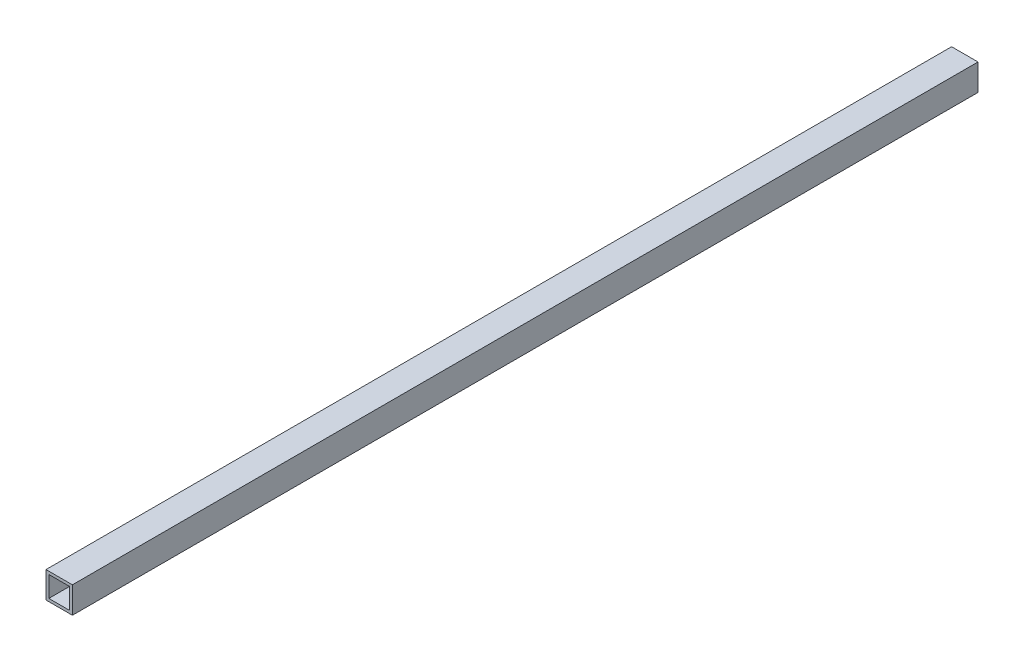
ISO-10303-21;
HEADER;
FILE_DESCRIPTION(('STEP AP214'),'2;1');
FILE_NAME('part.step','',(''),(''),'','','');
FILE_SCHEMA(('AUTOMOTIVE_DESIGN { 1 0 10303 214 1 1 1 1 }'));
ENDSEC;
DATA;
#1=APPLICATION_CONTEXT('core data for automotive mechanical design processes');
#2=APPLICATION_PROTOCOL_DEFINITION('international standard','automotive_design',2000,#1);
#3=PRODUCT_CONTEXT('',#1,'mechanical');
#4=PRODUCT('Part','Part','',(#3));
#5=PRODUCT_RELATED_PRODUCT_CATEGORY('part','',(#4));
#6=PRODUCT_DEFINITION_FORMATION('','',#4);
#7=PRODUCT_DEFINITION_CONTEXT('part definition',#1,'design');
#8=PRODUCT_DEFINITION('design','',#6,#7);
#9=PRODUCT_DEFINITION_SHAPE('','',#8);
#10=(LENGTH_UNIT() NAMED_UNIT(*) SI_UNIT(.MILLI.,.METRE.));
#11=(NAMED_UNIT(*) PLANE_ANGLE_UNIT() SI_UNIT($,.RADIAN.));
#12=(NAMED_UNIT(*) SI_UNIT($,.STERADIAN.) SOLID_ANGLE_UNIT());
#13=UNCERTAINTY_MEASURE_WITH_UNIT(LENGTH_MEASURE(1.E-05),#10,'distance_accuracy_value','');
#14=(GEOMETRIC_REPRESENTATION_CONTEXT(3) GLOBAL_UNCERTAINTY_ASSIGNED_CONTEXT((#13)) GLOBAL_UNIT_ASSIGNED_CONTEXT((#10,
#11,#12)) REPRESENTATION_CONTEXT('',''));
#15=CARTESIAN_POINT('',(0.,0.,0.));
#16=DIRECTION('',(0.,0.,1.));
#17=DIRECTION('',(1.,0.,0.));
#18=AXIS2_PLACEMENT_3D('',#15,#16,#17);
#19=CARTESIAN_POINT('',(0.,0.,480.));
#20=DIRECTION('',(0.,0.,1.));
#21=DIRECTION('',(1.,0.,0.));
#22=AXIS2_PLACEMENT_3D('',#19,#20,#21);
#23=PLANE('',#22);
#24=DIRECTION('',(0.,1.,0.));
#25=VECTOR('',#24,1.);
#26=CARTESIAN_POINT('',(7.,5.5,480.));
#27=LINE('',#26,#25);
#28=CARTESIAN_POINT('',(7.,-7.,480.));
#29=VERTEX_POINT('',#28);
#30=CARTESIAN_POINT('',(7.,7.,480.));
#31=VERTEX_POINT('',#30);
#32=EDGE_CURVE('E158',#29,#31,#27,.T.);
#33=ORIENTED_EDGE('',*,*,#32,.T.);
#34=DIRECTION('',(-1.,0.,0.));
#35=VECTOR('',#34,1.);
#36=CARTESIAN_POINT('',(-5.5,7.,480.));
#37=LINE('',#36,#35);
#38=CARTESIAN_POINT('',(-7.,7.,480.));
#39=VERTEX_POINT('',#38);
#40=EDGE_CURVE('E161',#31,#39,#37,.T.);
#41=ORIENTED_EDGE('',*,*,#40,.T.);
#42=DIRECTION('',(0.,-1.,0.));
#43=VECTOR('',#42,1.);
#44=CARTESIAN_POINT('',(-7.,5.5,480.));
#45=LINE('',#44,#43);
#46=CARTESIAN_POINT('',(-7.,-7.,480.));
#47=VERTEX_POINT('',#46);
#48=EDGE_CURVE('E164',#39,#47,#45,.T.);
#49=ORIENTED_EDGE('',*,*,#48,.T.);
#50=DIRECTION('',(1.,0.,0.));
#51=VECTOR('',#50,1.);
#52=CARTESIAN_POINT('',(-5.5,-7.,480.));
#53=LINE('',#52,#51);
#54=EDGE_CURVE('E166',#47,#29,#53,.T.);
#55=ORIENTED_EDGE('',*,*,#54,.T.);
#56=EDGE_LOOP('',(#33,#41,#49,#55));
#57=FACE_BOUND('',#56,.T.);
#58=DIRECTION('',(-1.,0.,0.));
#59=VECTOR('',#58,1.);
#60=CARTESIAN_POINT('',(-5.5,5.5,480.));
#61=LINE('',#60,#59);
#62=CARTESIAN_POINT('',(5.5,5.5,480.));
#63=VERTEX_POINT('',#62);
#64=CARTESIAN_POINT('',(-5.5,5.5,480.));
#65=VERTEX_POINT('',#64);
#66=EDGE_CURVE('E130',#63,#65,#61,.T.);
#67=ORIENTED_EDGE('',*,*,#66,.F.);
#68=DIRECTION('',(0.,1.,0.));
#69=VECTOR('',#68,1.);
#70=CARTESIAN_POINT('',(5.5,5.5,480.));
#71=LINE('',#70,#69);
#72=CARTESIAN_POINT('',(5.5,-5.5,480.));
#73=VERTEX_POINT('',#72);
#74=EDGE_CURVE('E122',#73,#63,#71,.T.);
#75=ORIENTED_EDGE('',*,*,#74,.F.);
#76=DIRECTION('',(1.,0.,0.));
#77=VECTOR('',#76,1.);
#78=CARTESIAN_POINT('',(-5.5,-5.5,480.));
#79=LINE('',#78,#77);
#80=CARTESIAN_POINT('',(-5.5,-5.5,480.));
#81=VERTEX_POINT('',#80);
#82=EDGE_CURVE('E144',#81,#73,#79,.T.);
#83=ORIENTED_EDGE('',*,*,#82,.F.);
#84=DIRECTION('',(0.,-1.,0.));
#85=VECTOR('',#84,1.);
#86=CARTESIAN_POINT('',(-5.5,5.5,480.));
#87=LINE('',#86,#85);
#88=EDGE_CURVE('E142',#65,#81,#87,.T.);
#89=ORIENTED_EDGE('',*,*,#88,.F.);
#90=EDGE_LOOP('',(#67,#75,#83,#89));
#91=FACE_BOUND('',#90,.T.);
#92=ADVANCED_FACE('F57',(#57,#91),#23,.T.);
#93=CARTESIAN_POINT('',(0.,0.,0.));
#94=DIRECTION('',(0.,0.,1.));
#95=DIRECTION('',(1.,0.,0.));
#96=AXIS2_PLACEMENT_3D('',#93,#94,#95);
#97=PLANE('',#96);
#98=DIRECTION('',(0.,1.,0.));
#99=VECTOR('',#98,1.);
#100=CARTESIAN_POINT('',(7.,5.5,0.));
#101=LINE('',#100,#99);
#102=CARTESIAN_POINT('',(7.,-7.,0.));
#103=VERTEX_POINT('',#102);
#104=CARTESIAN_POINT('',(7.,7.,0.));
#105=VERTEX_POINT('',#104);
#106=EDGE_CURVE('E138',#103,#105,#101,.T.);
#107=ORIENTED_EDGE('',*,*,#106,.F.);
#108=DIRECTION('',(1.,0.,0.));
#109=VECTOR('',#108,1.);
#110=CARTESIAN_POINT('',(-5.5,-7.,0.));
#111=LINE('',#110,#109);
#112=CARTESIAN_POINT('',(-7.,-7.,0.));
#113=VERTEX_POINT('',#112);
#114=EDGE_CURVE('E162',#113,#103,#111,.T.);
#115=ORIENTED_EDGE('',*,*,#114,.F.);
#116=DIRECTION('',(0.,-1.,0.));
#117=VECTOR('',#116,1.);
#118=CARTESIAN_POINT('',(-7.,5.5,0.));
#119=LINE('',#118,#117);
#120=CARTESIAN_POINT('',(-7.,7.,0.));
#121=VERTEX_POINT('',#120);
#122=EDGE_CURVE('E173',#121,#113,#119,.T.);
#123=ORIENTED_EDGE('',*,*,#122,.F.);
#124=DIRECTION('',(-1.,0.,0.));
#125=VECTOR('',#124,1.);
#126=CARTESIAN_POINT('',(-5.5,7.,0.));
#127=LINE('',#126,#125);
#128=EDGE_CURVE('E171',#105,#121,#127,.T.);
#129=ORIENTED_EDGE('',*,*,#128,.F.);
#130=EDGE_LOOP('',(#107,#115,#123,#129));
#131=FACE_BOUND('',#130,.T.);
#132=DIRECTION('',(0.,1.,0.));
#133=VECTOR('',#132,1.);
#134=CARTESIAN_POINT('',(5.5,5.5,0.));
#135=LINE('',#134,#133);
#136=CARTESIAN_POINT('',(5.5,-5.5,0.));
#137=VERTEX_POINT('',#136);
#138=CARTESIAN_POINT('',(5.5,5.5,0.));
#139=VERTEX_POINT('',#138);
#140=EDGE_CURVE('E80',#137,#139,#135,.T.);
#141=ORIENTED_EDGE('',*,*,#140,.T.);
#142=DIRECTION('',(-1.,0.,0.));
#143=VECTOR('',#142,1.);
#144=CARTESIAN_POINT('',(-5.5,5.5,0.));
#145=LINE('',#144,#143);
#146=CARTESIAN_POINT('',(-5.5,5.5,0.));
#147=VERTEX_POINT('',#146);
#148=EDGE_CURVE('E137',#139,#147,#145,.T.);
#149=ORIENTED_EDGE('',*,*,#148,.T.);
#150=DIRECTION('',(0.,-1.,0.));
#151=VECTOR('',#150,1.);
#152=CARTESIAN_POINT('',(-5.5,5.5,0.));
#153=LINE('',#152,#151);
#154=CARTESIAN_POINT('',(-5.5,-5.5,0.));
#155=VERTEX_POINT('',#154);
#156=EDGE_CURVE('E150',#147,#155,#153,.T.);
#157=ORIENTED_EDGE('',*,*,#156,.T.);
#158=DIRECTION('',(1.,0.,0.));
#159=VECTOR('',#158,1.);
#160=CARTESIAN_POINT('',(-5.5,-5.5,0.));
#161=LINE('',#160,#159);
#162=EDGE_CURVE('E131',#155,#137,#161,.T.);
#163=ORIENTED_EDGE('',*,*,#162,.T.);
#164=EDGE_LOOP('',(#141,#149,#157,#163));
#165=FACE_BOUND('',#164,.T.);
#166=ADVANCED_FACE('F191',(#131,#165),#97,.F.);
#167=CARTESIAN_POINT('',(7.,5.5,480.));
#168=DIRECTION('',(-1.,0.,0.));
#169=DIRECTION('',(0.,-1.,0.));
#170=AXIS2_PLACEMENT_3D('',#167,#168,#169);
#171=PLANE('',#170);
#172=ORIENTED_EDGE('',*,*,#106,.T.);
#173=DIRECTION('',(0.,0.,-1.));
#174=VECTOR('',#173,1.);
#175=CARTESIAN_POINT('',(7.,7.,480.));
#176=LINE('',#175,#174);
#177=EDGE_CURVE('E12',#31,#105,#176,.T.);
#178=ORIENTED_EDGE('',*,*,#177,.F.);
#179=ORIENTED_EDGE('',*,*,#32,.F.);
#180=DIRECTION('',(0.,0.,-1.));
#181=VECTOR('',#180,1.);
#182=CARTESIAN_POINT('',(7.,-7.,480.));
#183=LINE('',#182,#181);
#184=EDGE_CURVE('E168',#29,#103,#183,.T.);
#185=ORIENTED_EDGE('',*,*,#184,.T.);
#186=EDGE_LOOP('',(#172,#178,#179,#185));
#187=FACE_BOUND('',#186,.T.);
#188=ADVANCED_FACE('F59',(#187),#171,.F.);
#189=CARTESIAN_POINT('',(-5.5,7.,480.));
#190=DIRECTION('',(0.,-1.,0.));
#191=DIRECTION('',(0.,0.,-1.));
#192=AXIS2_PLACEMENT_3D('',#189,#190,#191);
#193=PLANE('',#192);
#194=ORIENTED_EDGE('',*,*,#128,.T.);
#195=DIRECTION('',(0.,0.,-1.));
#196=VECTOR('',#195,1.);
#197=CARTESIAN_POINT('',(-7.,7.,480.));
#198=LINE('',#197,#196);
#199=EDGE_CURVE('E65',#39,#121,#198,.T.);
#200=ORIENTED_EDGE('',*,*,#199,.F.);
#201=ORIENTED_EDGE('',*,*,#40,.F.);
#202=ORIENTED_EDGE('',*,*,#177,.T.);
#203=EDGE_LOOP('',(#194,#200,#201,#202));
#204=FACE_BOUND('',#203,.T.);
#205=ADVANCED_FACE('F201',(#204),#193,.F.);
#206=CARTESIAN_POINT('',(-7.,5.5,480.));
#207=DIRECTION('',(1.,0.,0.));
#208=DIRECTION('',(0.,1.,0.));
#209=AXIS2_PLACEMENT_3D('',#206,#207,#208);
#210=PLANE('',#209);
#211=ORIENTED_EDGE('',*,*,#122,.T.);
#212=DIRECTION('',(0.,0.,-1.));
#213=VECTOR('',#212,1.);
#214=CARTESIAN_POINT('',(-7.,-7.,480.));
#215=LINE('',#214,#213);
#216=EDGE_CURVE('E178',#47,#113,#215,.T.);
#217=ORIENTED_EDGE('',*,*,#216,.F.);
#218=ORIENTED_EDGE('',*,*,#48,.F.);
#219=ORIENTED_EDGE('',*,*,#199,.T.);
#220=EDGE_LOOP('',(#211,#217,#218,#219));
#221=FACE_BOUND('',#220,.T.);
#222=ADVANCED_FACE('F185',(#221),#210,.F.);
#223=CARTESIAN_POINT('',(-5.5,-7.,480.));
#224=DIRECTION('',(0.,1.,0.));
#225=DIRECTION('',(0.,0.,1.));
#226=AXIS2_PLACEMENT_3D('',#223,#224,#225);
#227=PLANE('',#226);
#228=ORIENTED_EDGE('',*,*,#114,.T.);
#229=ORIENTED_EDGE('',*,*,#184,.F.);
#230=ORIENTED_EDGE('',*,*,#54,.F.);
#231=ORIENTED_EDGE('',*,*,#216,.T.);
#232=EDGE_LOOP('',(#228,#229,#230,#231));
#233=FACE_BOUND('',#232,.T.);
#234=ADVANCED_FACE('F195',(#233),#227,.F.);
#235=CARTESIAN_POINT('',(5.5,5.5,480.));
#236=DIRECTION('',(-1.,0.,0.));
#237=DIRECTION('',(0.,-1.,0.));
#238=AXIS2_PLACEMENT_3D('',#235,#236,#237);
#239=PLANE('',#238);
#240=ORIENTED_EDGE('',*,*,#140,.F.);
#241=DIRECTION('',(0.,0.,-1.));
#242=VECTOR('',#241,1.);
#243=CARTESIAN_POINT('',(5.5,-5.5,480.));
#244=LINE('',#243,#242);
#245=EDGE_CURVE('E126',#73,#137,#244,.T.);
#246=ORIENTED_EDGE('',*,*,#245,.F.);
#247=ORIENTED_EDGE('',*,*,#74,.T.);
#248=DIRECTION('',(0.,0.,-1.));
#249=VECTOR('',#248,1.);
#250=CARTESIAN_POINT('',(5.5,5.5,480.));
#251=LINE('',#250,#249);
#252=EDGE_CURVE('E125',#63,#139,#251,.T.);
#253=ORIENTED_EDGE('',*,*,#252,.T.);
#254=EDGE_LOOP('',(#240,#246,#247,#253));
#255=FACE_BOUND('',#254,.T.);
#256=ADVANCED_FACE('F124',(#255),#239,.T.);
#257=CARTESIAN_POINT('',(-5.5,5.5,480.));
#258=DIRECTION('',(0.,-1.,0.));
#259=DIRECTION('',(0.,0.,-1.));
#260=AXIS2_PLACEMENT_3D('',#257,#258,#259);
#261=PLANE('',#260);
#262=ORIENTED_EDGE('',*,*,#148,.F.);
#263=ORIENTED_EDGE('',*,*,#252,.F.);
#264=ORIENTED_EDGE('',*,*,#66,.T.);
#265=DIRECTION('',(0.,0.,-1.));
#266=VECTOR('',#265,1.);
#267=CARTESIAN_POINT('',(-5.5,5.5,480.));
#268=LINE('',#267,#266);
#269=EDGE_CURVE('E139',#65,#147,#268,.T.);
#270=ORIENTED_EDGE('',*,*,#269,.T.);
#271=EDGE_LOOP('',(#262,#263,#264,#270));
#272=FACE_BOUND('',#271,.T.);
#273=ADVANCED_FACE('F134',(#272),#261,.T.);
#274=CARTESIAN_POINT('',(-5.5,5.5,480.));
#275=DIRECTION('',(1.,0.,0.));
#276=DIRECTION('',(0.,1.,0.));
#277=AXIS2_PLACEMENT_3D('',#274,#275,#276);
#278=PLANE('',#277);
#279=ORIENTED_EDGE('',*,*,#156,.F.);
#280=ORIENTED_EDGE('',*,*,#269,.F.);
#281=ORIENTED_EDGE('',*,*,#88,.T.);
#282=DIRECTION('',(0.,0.,-1.));
#283=VECTOR('',#282,1.);
#284=CARTESIAN_POINT('',(-5.5,-5.5,480.));
#285=LINE('',#284,#283);
#286=EDGE_CURVE('E72',#81,#155,#285,.T.);
#287=ORIENTED_EDGE('',*,*,#286,.T.);
#288=EDGE_LOOP('',(#279,#280,#281,#287));
#289=FACE_BOUND('',#288,.T.);
#290=ADVANCED_FACE('F224',(#289),#278,.T.);
#291=CARTESIAN_POINT('',(-5.5,-5.5,480.));
#292=DIRECTION('',(0.,1.,0.));
#293=DIRECTION('',(0.,0.,1.));
#294=AXIS2_PLACEMENT_3D('',#291,#292,#293);
#295=PLANE('',#294);
#296=ORIENTED_EDGE('',*,*,#162,.F.);
#297=ORIENTED_EDGE('',*,*,#286,.F.);
#298=ORIENTED_EDGE('',*,*,#82,.T.);
#299=ORIENTED_EDGE('',*,*,#245,.T.);
#300=EDGE_LOOP('',(#296,#297,#298,#299));
#301=FACE_BOUND('',#300,.T.);
#302=ADVANCED_FACE('F228',(#301),#295,.T.);
#303=CLOSED_SHELL('',(#92,#166,#188,#205,#222,#234,#256,#273,#290,#302));
#304=MANIFOLD_SOLID_BREP('B2',#303);
#305=ADVANCED_BREP_SHAPE_REPRESENTATION('',(#18,#304),#14);
#306=SHAPE_DEFINITION_REPRESENTATION(#9,#305);
ENDSEC;
END-ISO-10303-21;
